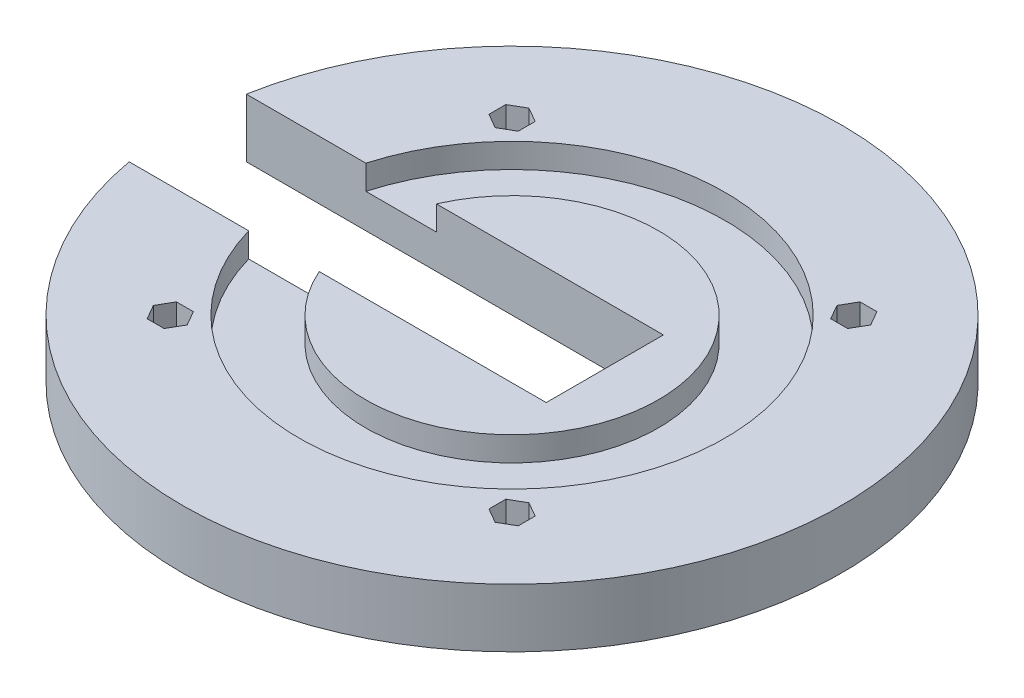
ISO-10303-21;
HEADER;
FILE_DESCRIPTION(('STEP AP214'),'2;1');
FILE_NAME('part.step','',(''),(''),'','','');
FILE_SCHEMA(('AUTOMOTIVE_DESIGN { 1 0 10303 214 1 1 1 1 }'));
ENDSEC;
DATA;
#1=APPLICATION_CONTEXT('core data for automotive mechanical design processes');
#2=APPLICATION_PROTOCOL_DEFINITION('international standard','automotive_design',2000,#1);
#3=PRODUCT_CONTEXT('',#1,'mechanical');
#4=PRODUCT('Part','Part','',(#3));
#5=PRODUCT_RELATED_PRODUCT_CATEGORY('part','',(#4));
#6=PRODUCT_DEFINITION_FORMATION('','',#4);
#7=PRODUCT_DEFINITION_CONTEXT('part definition',#1,'design');
#8=PRODUCT_DEFINITION('design','',#6,#7);
#9=PRODUCT_DEFINITION_SHAPE('','',#8);
#10=(LENGTH_UNIT() NAMED_UNIT(*) SI_UNIT(.MILLI.,.METRE.));
#11=(NAMED_UNIT(*) PLANE_ANGLE_UNIT() SI_UNIT($,.RADIAN.));
#12=(NAMED_UNIT(*) SI_UNIT($,.STERADIAN.) SOLID_ANGLE_UNIT());
#13=UNCERTAINTY_MEASURE_WITH_UNIT(LENGTH_MEASURE(1.E-05),#10,'distance_accuracy_value','');
#14=(GEOMETRIC_REPRESENTATION_CONTEXT(3) GLOBAL_UNCERTAINTY_ASSIGNED_CONTEXT((#13)) GLOBAL_UNIT_ASSIGNED_CONTEXT((#10,
#11,#12)) REPRESENTATION_CONTEXT('',''));
#15=CARTESIAN_POINT('',(0.,0.,0.));
#16=DIRECTION('',(0.,0.,1.));
#17=DIRECTION('',(1.,0.,0.));
#18=AXIS2_PLACEMENT_3D('',#15,#16,#17);
#19=CARTESIAN_POINT('',(0.,12.,0.));
#20=DIRECTION('',(0.,1.,0.));
#21=DIRECTION('',(0.,0.,1.));
#22=AXIS2_PLACEMENT_3D('',#19,#20,#21);
#23=PLANE('',#22);
#24=DIRECTION('',(1.,0.,0.));
#25=VECTOR('',#24,1.);
#26=CARTESIAN_POINT('',(-41.,12.,12.));
#27=LINE('',#26,#25);
#28=CARTESIAN_POINT('',(-27.495454169735,12.,12.));
#29=VERTEX_POINT('',#28);
#30=CARTESIAN_POINT('',(19.,12.,12.));
#31=VERTEX_POINT('',#30);
#32=EDGE_CURVE('E470',#29,#31,#27,.T.);
#33=ORIENTED_EDGE('',*,*,#32,.F.);
#34=CARTESIAN_POINT('',(0.,12.,0.));
#35=DIRECTION('',(0.,1.,0.));
#36=DIRECTION('',(0.,0.,1.));
#37=AXIS2_PLACEMENT_3D('',#34,#35,#36);
#38=CIRCLE('',#37,30.);
#39=CARTESIAN_POINT('',(-27.495454169735,12.,-12.));
#40=VERTEX_POINT('',#39);
#41=EDGE_CURVE('E266',#29,#40,#38,.T.);
#42=ORIENTED_EDGE('',*,*,#41,.T.);
#43=DIRECTION('',(-1.,0.,0.));
#44=VECTOR('',#43,1.);
#45=CARTESIAN_POINT('',(-41.,12.,-12.));
#46=LINE('',#45,#44);
#47=CARTESIAN_POINT('',(19.,12.,-12.));
#48=VERTEX_POINT('',#47);
#49=EDGE_CURVE('E477',#48,#40,#46,.T.);
#50=ORIENTED_EDGE('',*,*,#49,.F.);
#51=DIRECTION('',(0.,0.,-1.));
#52=VECTOR('',#51,1.);
#53=CARTESIAN_POINT('',(19.,12.,12.));
#54=LINE('',#53,#52);
#55=EDGE_CURVE('E455',#31,#48,#54,.T.);
#56=ORIENTED_EDGE('',*,*,#55,.F.);
#57=EDGE_LOOP('',(#33,#42,#50,#56));
#58=FACE_BOUND('',#57,.T.);
#59=ADVANCED_FACE('F35',(#58),#23,.T.);
#60=CARTESIAN_POINT('',(-41.,0.,12.));
#61=DIRECTION('',(0.,0.,1.));
#62=DIRECTION('',(1.,0.,0.));
#63=AXIS2_PLACEMENT_3D('',#60,#61,#62);
#64=PLANE('',#63);
#65=DIRECTION('',(-1.,0.,0.));
#66=VECTOR('',#65,1.);
#67=CARTESIAN_POINT('',(-41.,7.,12.));
#68=LINE('',#67,#66);
#69=CARTESIAN_POINT('',(-27.495454169735,7.,12.));
#70=VERTEX_POINT('',#69);
#71=CARTESIAN_POINT('',(-41.9421104023152,7.,12.));
#72=VERTEX_POINT('',#71);
#73=EDGE_CURVE('E271',#70,#72,#68,.T.);
#74=ORIENTED_EDGE('',*,*,#73,.F.);
#75=DIRECTION('',(0.,1.,0.));
#76=VECTOR('',#75,1.);
#77=CARTESIAN_POINT('',(-27.495454169735,7.,12.));
#78=LINE('',#77,#76);
#79=EDGE_CURVE('E264',#29,#70,#78,.F.);
#80=ORIENTED_EDGE('',*,*,#79,.F.);
#81=ORIENTED_EDGE('',*,*,#32,.T.);
#82=DIRECTION('',(0.,1.,0.));
#83=VECTOR('',#82,1.);
#84=CARTESIAN_POINT('',(19.,0.,12.));
#85=LINE('',#84,#83);
#86=CARTESIAN_POINT('',(19.,0.,12.));
#87=VERTEX_POINT('',#86);
#88=EDGE_CURVE('E481',#87,#31,#85,.T.);
#89=ORIENTED_EDGE('',*,*,#88,.F.);
#90=DIRECTION('',(1.,0.,0.));
#91=VECTOR('',#90,1.);
#92=CARTESIAN_POINT('',(-41.,0.,12.));
#93=LINE('',#92,#91);
#94=CARTESIAN_POINT('',(-66.4247694764536,0.,12.));
#95=VERTEX_POINT('',#94);
#96=EDGE_CURVE('E472',#95,#87,#93,.T.);
#97=ORIENTED_EDGE('',*,*,#96,.F.);
#98=DIRECTION('',(0.,-1.,0.));
#99=VECTOR('',#98,1.);
#100=CARTESIAN_POINT('',(-66.4247694764536,12.,12.));
#101=LINE('',#100,#99);
#102=CARTESIAN_POINT('',(-66.4247694764536,12.,12.));
#103=VERTEX_POINT('',#102);
#104=EDGE_CURVE('E504',#103,#95,#101,.T.);
#105=ORIENTED_EDGE('',*,*,#104,.F.);
#106=DIRECTION('',(1.,0.,0.));
#107=VECTOR('',#106,1.);
#108=CARTESIAN_POINT('',(-41.,12.,12.));
#109=LINE('',#108,#107);
#110=CARTESIAN_POINT('',(-41.9421104023152,12.,12.));
#111=VERTEX_POINT('',#110);
#112=EDGE_CURVE('E50',#103,#111,#109,.T.);
#113=ORIENTED_EDGE('',*,*,#112,.T.);
#114=DIRECTION('',(0.,1.,0.));
#115=VECTOR('',#114,1.);
#116=CARTESIAN_POINT('',(-41.9421104023152,7.,12.));
#117=LINE('',#116,#115);
#118=EDGE_CURVE('E11',#72,#111,#117,.T.);
#119=ORIENTED_EDGE('',*,*,#118,.F.);
#120=EDGE_LOOP('',(#74,#80,#81,#89,#97,#105,#113,#119));
#121=FACE_BOUND('',#120,.T.);
#122=ADVANCED_FACE('F518',(#121),#64,.F.);
#123=CARTESIAN_POINT('',(-41.,0.,-12.));
#124=DIRECTION('',(0.,0.,-1.));
#125=DIRECTION('',(-1.,0.,0.));
#126=AXIS2_PLACEMENT_3D('',#123,#124,#125);
#127=PLANE('',#126);
#128=DIRECTION('',(1.,0.,0.));
#129=VECTOR('',#128,1.);
#130=CARTESIAN_POINT('',(-41.,7.,-12.));
#131=LINE('',#130,#129);
#132=CARTESIAN_POINT('',(-41.9421104023152,7.,-12.));
#133=VERTEX_POINT('',#132);
#134=CARTESIAN_POINT('',(-27.495454169735,7.,-12.));
#135=VERTEX_POINT('',#134);
#136=EDGE_CURVE('E57',#133,#135,#131,.T.);
#137=ORIENTED_EDGE('',*,*,#136,.F.);
#138=DIRECTION('',(0.,1.,0.));
#139=VECTOR('',#138,1.);
#140=CARTESIAN_POINT('',(-41.9421104023152,7.,-12.));
#141=LINE('',#140,#139);
#142=CARTESIAN_POINT('',(-41.9421104023152,12.,-12.));
#143=VERTEX_POINT('',#142);
#144=EDGE_CURVE('E43',#143,#133,#141,.F.);
#145=ORIENTED_EDGE('',*,*,#144,.F.);
#146=DIRECTION('',(-1.,0.,0.));
#147=VECTOR('',#146,1.);
#148=CARTESIAN_POINT('',(-41.,12.,-12.));
#149=LINE('',#148,#147);
#150=CARTESIAN_POINT('',(-66.4247694764536,12.,-12.));
#151=VERTEX_POINT('',#150);
#152=EDGE_CURVE('E245',#143,#151,#149,.T.);
#153=ORIENTED_EDGE('',*,*,#152,.T.);
#154=DIRECTION('',(0.,-1.,0.));
#155=VECTOR('',#154,1.);
#156=CARTESIAN_POINT('',(-66.4247694764536,12.,-12.));
#157=LINE('',#156,#155);
#158=CARTESIAN_POINT('',(-66.4247694764536,0.,-12.));
#159=VERTEX_POINT('',#158);
#160=EDGE_CURVE('E506',#159,#151,#157,.F.);
#161=ORIENTED_EDGE('',*,*,#160,.F.);
#162=DIRECTION('',(-1.,0.,0.));
#163=VECTOR('',#162,1.);
#164=CARTESIAN_POINT('',(-41.,0.,-12.));
#165=LINE('',#164,#163);
#166=CARTESIAN_POINT('',(19.,0.,-12.));
#167=VERTEX_POINT('',#166);
#168=EDGE_CURVE('E469',#167,#159,#165,.T.);
#169=ORIENTED_EDGE('',*,*,#168,.F.);
#170=DIRECTION('',(0.,1.,0.));
#171=VECTOR('',#170,1.);
#172=CARTESIAN_POINT('',(19.,0.,-12.));
#173=LINE('',#172,#171);
#174=EDGE_CURVE('E475',#167,#48,#173,.T.);
#175=ORIENTED_EDGE('',*,*,#174,.T.);
#176=ORIENTED_EDGE('',*,*,#49,.T.);
#177=DIRECTION('',(0.,1.,0.));
#178=VECTOR('',#177,1.);
#179=CARTESIAN_POINT('',(-27.495454169735,7.,-12.));
#180=LINE('',#179,#178);
#181=EDGE_CURVE('E488',#135,#40,#180,.T.);
#182=ORIENTED_EDGE('',*,*,#181,.F.);
#183=EDGE_LOOP('',(#137,#145,#153,#161,#169,#175,#176,#182));
#184=FACE_BOUND('',#183,.T.);
#185=ADVANCED_FACE('F243',(#184),#127,.F.);
#186=CARTESIAN_POINT('',(0.,12.,0.));
#187=DIRECTION('',(0.,-1.,0.));
#188=DIRECTION('',(0.,0.,-1.));
#189=AXIS2_PLACEMENT_3D('',#186,#187,#188);
#190=CYLINDRICAL_SURFACE('',#189,67.5);
#191=CARTESIAN_POINT('',(0.,12.,0.));
#192=DIRECTION('',(0.,1.,0.));
#193=DIRECTION('',(0.,0.,1.));
#194=AXIS2_PLACEMENT_3D('',#191,#192,#193);
#195=CIRCLE('',#194,67.5);
#196=EDGE_CURVE('E258',#103,#151,#195,.T.);
#197=ORIENTED_EDGE('',*,*,#196,.F.);
#198=ORIENTED_EDGE('',*,*,#104,.T.);
#199=CARTESIAN_POINT('',(0.,0.,0.));
#200=DIRECTION('',(0.,1.,0.));
#201=DIRECTION('',(0.,0.,1.));
#202=AXIS2_PLACEMENT_3D('',#199,#200,#201);
#203=CIRCLE('',#202,67.5);
#204=EDGE_CURVE('E484',#95,#159,#203,.T.);
#205=ORIENTED_EDGE('',*,*,#204,.T.);
#206=ORIENTED_EDGE('',*,*,#160,.T.);
#207=EDGE_LOOP('',(#197,#198,#205,#206));
#208=FACE_BOUND('',#207,.T.);
#209=ADVANCED_FACE('F37',(#208),#190,.T.);
#210=ORIENTED_EDGE('',*,*,#112,.F.);
#211=ORIENTED_EDGE('',*,*,#196,.T.);
#212=ORIENTED_EDGE('',*,*,#152,.F.);
#213=CARTESIAN_POINT('',(0.,12.,0.));
#214=DIRECTION('',(0.,1.,0.));
#215=DIRECTION('',(0.,0.,1.));
#216=AXIS2_PLACEMENT_3D('',#213,#214,#215);
#217=CIRCLE('',#216,43.625);
#218=EDGE_CURVE('E256',#111,#143,#217,.T.);
#219=ORIENTED_EDGE('',*,*,#218,.F.);
#220=EDGE_LOOP('',(#210,#211,#212,#219));
#221=FACE_BOUND('',#220,.T.);
#222=DIRECTION('',(-0.866025403784439,0.,-0.5));
#223=VECTOR('',#222,1.);
#224=CARTESIAN_POINT('',(-32.0017856687342,12.,-36.733836476302));
#225=LINE('',#224,#223);
#226=CARTESIAN_POINT('',(-32.0017856687342,12.,-36.733836476302));
#227=VERTEX_POINT('',#226);
#228=CARTESIAN_POINT('',(-35.0017856687342,12.,-38.4658872838709));
#229=VERTEX_POINT('',#228);
#230=EDGE_CURVE('E273',#227,#229,#225,.T.);
#231=ORIENTED_EDGE('',*,*,#230,.F.);
#232=DIRECTION('',(0.,0.,-1.));
#233=VECTOR('',#232,1.);
#234=CARTESIAN_POINT('',(-32.0017856687342,12.,-33.2697348611643));
#235=LINE('',#234,#233);
#236=CARTESIAN_POINT('',(-32.0017856687342,12.,-33.2697348611643));
#237=VERTEX_POINT('',#236);
#238=EDGE_CURVE('E376',#237,#227,#235,.T.);
#239=ORIENTED_EDGE('',*,*,#238,.F.);
#240=DIRECTION('',(0.866025403784439,0.,-0.499999999999999));
#241=VECTOR('',#240,1.);
#242=CARTESIAN_POINT('',(-35.0017856687342,12.,-31.5376840535954));
#243=LINE('',#242,#241);
#244=CARTESIAN_POINT('',(-35.0017856687342,12.,-31.5376840535954));
#245=VERTEX_POINT('',#244);
#246=EDGE_CURVE('E402',#245,#237,#243,.T.);
#247=ORIENTED_EDGE('',*,*,#246,.F.);
#248=DIRECTION('',(0.866025403784438,0.,0.500000000000001));
#249=VECTOR('',#248,1.);
#250=CARTESIAN_POINT('',(-38.0017856687342,12.,-33.2697348611643));
#251=LINE('',#250,#249);
#252=CARTESIAN_POINT('',(-38.0017856687342,12.,-33.2697348611643));
#253=VERTEX_POINT('',#252);
#254=EDGE_CURVE('E399',#253,#245,#251,.T.);
#255=ORIENTED_EDGE('',*,*,#254,.F.);
#256=DIRECTION('',(0.,0.,1.));
#257=VECTOR('',#256,1.);
#258=CARTESIAN_POINT('',(-38.0017856687342,12.,-36.733836476302));
#259=LINE('',#258,#257);
#260=CARTESIAN_POINT('',(-38.0017856687342,12.,-36.733836476302));
#261=VERTEX_POINT('',#260);
#262=EDGE_CURVE('E396',#261,#253,#259,.T.);
#263=ORIENTED_EDGE('',*,*,#262,.F.);
#264=DIRECTION('',(-0.866025403784439,0.,0.5));
#265=VECTOR('',#264,1.);
#266=CARTESIAN_POINT('',(-35.0017856687342,12.,-38.4658872838709));
#267=LINE('',#266,#265);
#268=EDGE_CURVE('E393',#229,#261,#267,.T.);
#269=ORIENTED_EDGE('',*,*,#268,.F.);
#270=EDGE_LOOP('',(#231,#239,#247,#255,#263,#269));
#271=FACE_BOUND('',#270,.T.);
#272=DIRECTION('',(-0.5,0.,0.866025403784439));
#273=VECTOR('',#272,1.);
#274=CARTESIAN_POINT('',(-36.733836476302,12.,32.0017856687351));
#275=LINE('',#274,#273);
#276=CARTESIAN_POINT('',(-36.733836476302,12.,32.0017856687351));
#277=VERTEX_POINT('',#276);
#278=CARTESIAN_POINT('',(-38.4658872838709,12.,35.0017856687351));
#279=VERTEX_POINT('',#278);
#280=EDGE_CURVE('E344',#277,#279,#275,.T.);
#281=ORIENTED_EDGE('',*,*,#280,.F.);
#282=DIRECTION('',(-1.,0.,0.));
#283=VECTOR('',#282,1.);
#284=CARTESIAN_POINT('',(-33.2697348611643,12.,32.0017856687351));
#285=LINE('',#284,#283);
#286=CARTESIAN_POINT('',(-33.2697348611643,12.,32.0017856687351));
#287=VERTEX_POINT('',#286);
#288=EDGE_CURVE('E328',#287,#277,#285,.T.);
#289=ORIENTED_EDGE('',*,*,#288,.F.);
#290=DIRECTION('',(-0.499999999999999,0.,-0.866025403784439));
#291=VECTOR('',#290,1.);
#292=CARTESIAN_POINT('',(-31.5376840535954,12.,35.0017856687351));
#293=LINE('',#292,#291);
#294=CARTESIAN_POINT('',(-31.5376840535954,12.,35.0017856687351));
#295=VERTEX_POINT('',#294);
#296=EDGE_CURVE('E356',#295,#287,#293,.T.);
#297=ORIENTED_EDGE('',*,*,#296,.F.);
#298=DIRECTION('',(0.500000000000001,0.,-0.866025403784438));
#299=VECTOR('',#298,1.);
#300=CARTESIAN_POINT('',(-33.2697348611643,12.,38.0017856687351));
#301=LINE('',#300,#299);
#302=CARTESIAN_POINT('',(-33.2697348611643,12.,38.0017856687351));
#303=VERTEX_POINT('',#302);
#304=EDGE_CURVE('E353',#303,#295,#301,.T.);
#305=ORIENTED_EDGE('',*,*,#304,.F.);
#306=DIRECTION('',(1.,0.,0.));
#307=VECTOR('',#306,1.);
#308=CARTESIAN_POINT('',(-36.733836476302,12.,38.0017856687351));
#309=LINE('',#308,#307);
#310=CARTESIAN_POINT('',(-36.733836476302,12.,38.0017856687351));
#311=VERTEX_POINT('',#310);
#312=EDGE_CURVE('E350',#311,#303,#309,.T.);
#313=ORIENTED_EDGE('',*,*,#312,.F.);
#314=DIRECTION('',(0.5,0.,0.866025403784439));
#315=VECTOR('',#314,1.);
#316=CARTESIAN_POINT('',(-38.4658872838709,12.,35.0017856687351));
#317=LINE('',#316,#315);
#318=EDGE_CURVE('E346',#279,#311,#317,.T.);
#319=ORIENTED_EDGE('',*,*,#318,.F.);
#320=EDGE_LOOP('',(#281,#289,#297,#305,#313,#319));
#321=FACE_BOUND('',#320,.T.);
#322=DIRECTION('',(0.866025403784439,0.,0.5));
#323=VECTOR('',#322,1.);
#324=CARTESIAN_POINT('',(32.0017856687351,12.,36.733836476303));
#325=LINE('',#324,#323);
#326=CARTESIAN_POINT('',(32.0017856687351,12.,36.733836476303));
#327=VERTEX_POINT('',#326);
#328=CARTESIAN_POINT('',(35.0017856687351,12.,38.4658872838718));
#329=VERTEX_POINT('',#328);
#330=EDGE_CURVE('E294',#327,#329,#325,.T.);
#331=ORIENTED_EDGE('',*,*,#330,.F.);
#332=DIRECTION('',(0.,0.,1.));
#333=VECTOR('',#332,1.);
#334=CARTESIAN_POINT('',(32.0017856687351,12.,33.2697348611652));
#335=LINE('',#334,#333);
#336=CARTESIAN_POINT('',(32.0017856687351,12.,33.2697348611652));
#337=VERTEX_POINT('',#336);
#338=EDGE_CURVE('E278',#337,#327,#335,.T.);
#339=ORIENTED_EDGE('',*,*,#338,.F.);
#340=DIRECTION('',(-0.866025403784439,0.,0.499999999999999));
#341=VECTOR('',#340,1.);
#342=CARTESIAN_POINT('',(35.0017856687351,12.,31.5376840535963));
#343=LINE('',#342,#341);
#344=CARTESIAN_POINT('',(35.0017856687351,12.,31.5376840535963));
#345=VERTEX_POINT('',#344);
#346=EDGE_CURVE('E306',#345,#337,#343,.T.);
#347=ORIENTED_EDGE('',*,*,#346,.F.);
#348=DIRECTION('',(-0.866025403784438,0.,-0.500000000000001));
#349=VECTOR('',#348,1.);
#350=CARTESIAN_POINT('',(38.0017856687351,12.,33.2697348611652));
#351=LINE('',#350,#349);
#352=CARTESIAN_POINT('',(38.0017856687351,12.,33.2697348611652));
#353=VERTEX_POINT('',#352);
#354=EDGE_CURVE('E303',#353,#345,#351,.T.);
#355=ORIENTED_EDGE('',*,*,#354,.F.);
#356=DIRECTION('',(0.,0.,-1.));
#357=VECTOR('',#356,1.);
#358=CARTESIAN_POINT('',(38.0017856687351,12.,36.7338364763029));
#359=LINE('',#358,#357);
#360=CARTESIAN_POINT('',(38.0017856687351,12.,36.7338364763029));
#361=VERTEX_POINT('',#360);
#362=EDGE_CURVE('E300',#361,#353,#359,.T.);
#363=ORIENTED_EDGE('',*,*,#362,.F.);
#364=DIRECTION('',(0.866025403784439,0.,-0.5));
#365=VECTOR('',#364,1.);
#366=CARTESIAN_POINT('',(35.0017856687351,12.,38.4658872838718));
#367=LINE('',#366,#365);
#368=EDGE_CURVE('E296',#329,#361,#367,.T.);
#369=ORIENTED_EDGE('',*,*,#368,.F.);
#370=EDGE_LOOP('',(#331,#339,#347,#355,#363,#369));
#371=FACE_BOUND('',#370,.T.);
#372=DIRECTION('',(0.499999999999999,0.,-0.866025403784439));
#373=VECTOR('',#372,1.);
#374=CARTESIAN_POINT('',(36.7338364763029,12.,-32.0017856687342));
#375=LINE('',#374,#373);
#376=CARTESIAN_POINT('',(36.7338364763029,12.,-32.0017856687342));
#377=VERTEX_POINT('',#376);
#378=CARTESIAN_POINT('',(38.4658872838718,12.,-35.0017856687342));
#379=VERTEX_POINT('',#378);
#380=EDGE_CURVE('E313',#377,#379,#375,.T.);
#381=ORIENTED_EDGE('',*,*,#380,.F.);
#382=DIRECTION('',(1.,0.,0.));
#383=VECTOR('',#382,1.);
#384=CARTESIAN_POINT('',(33.2697348611652,12.,-32.0017856687342));
#385=LINE('',#384,#383);
#386=CARTESIAN_POINT('',(33.2697348611652,12.,-32.0017856687342));
#387=VERTEX_POINT('',#386);
#388=EDGE_CURVE('E422',#387,#377,#385,.T.);
#389=ORIENTED_EDGE('',*,*,#388,.F.);
#390=DIRECTION('',(0.499999999999999,0.,0.866025403784439));
#391=VECTOR('',#390,1.);
#392=CARTESIAN_POINT('',(31.5376840535963,12.,-35.0017856687342));
#393=LINE('',#392,#391);
#394=CARTESIAN_POINT('',(31.5376840535963,12.,-35.0017856687342));
#395=VERTEX_POINT('',#394);
#396=EDGE_CURVE('E448',#395,#387,#393,.T.);
#397=ORIENTED_EDGE('',*,*,#396,.F.);
#398=DIRECTION('',(-0.5,0.,0.866025403784439));
#399=VECTOR('',#398,1.);
#400=CARTESIAN_POINT('',(33.2697348611652,12.,-38.0017856687342));
#401=LINE('',#400,#399);
#402=CARTESIAN_POINT('',(33.2697348611652,12.,-38.0017856687342));
#403=VERTEX_POINT('',#402);
#404=EDGE_CURVE('E445',#403,#395,#401,.T.);
#405=ORIENTED_EDGE('',*,*,#404,.F.);
#406=DIRECTION('',(-1.,0.,0.));
#407=VECTOR('',#406,1.);
#408=CARTESIAN_POINT('',(36.7338364763029,12.,-38.0017856687342));
#409=LINE('',#408,#407);
#410=CARTESIAN_POINT('',(36.7338364763029,12.,-38.0017856687342));
#411=VERTEX_POINT('',#410);
#412=EDGE_CURVE('E442',#411,#403,#409,.T.);
#413=ORIENTED_EDGE('',*,*,#412,.F.);
#414=DIRECTION('',(-0.5,0.,-0.866025403784438));
#415=VECTOR('',#414,1.);
#416=CARTESIAN_POINT('',(38.4658872838718,12.,-35.0017856687342));
#417=LINE('',#416,#415);
#418=EDGE_CURVE('E439',#379,#411,#417,.T.);
#419=ORIENTED_EDGE('',*,*,#418,.F.);
#420=EDGE_LOOP('',(#381,#389,#397,#405,#413,#419));
#421=FACE_BOUND('',#420,.T.);
#422=ADVANCED_FACE('F254',(#221,#271,#321,#371,#421),#23,.T.);
#423=CARTESIAN_POINT('',(0.,0.,0.));
#424=DIRECTION('',(0.,1.,0.));
#425=DIRECTION('',(0.,0.,1.));
#426=AXIS2_PLACEMENT_3D('',#423,#424,#425);
#427=PLANE('',#426);
#428=DIRECTION('',(0.,0.,-1.));
#429=VECTOR('',#428,1.);
#430=CARTESIAN_POINT('',(-32.0017856687342,0.,-33.2697348611643));
#431=LINE('',#430,#429);
#432=CARTESIAN_POINT('',(-32.0017856687342,0.,-33.2697348611643));
#433=VERTEX_POINT('',#432);
#434=CARTESIAN_POINT('',(-32.0017856687342,0.,-36.733836476302));
#435=VERTEX_POINT('',#434);
#436=EDGE_CURVE('E388',#433,#435,#431,.T.);
#437=ORIENTED_EDGE('',*,*,#436,.T.);
#438=DIRECTION('',(-0.866025403784439,0.,-0.5));
#439=VECTOR('',#438,1.);
#440=CARTESIAN_POINT('',(-32.0017856687342,0.,-36.733836476302));
#441=LINE('',#440,#439);
#442=CARTESIAN_POINT('',(-35.0017856687342,0.,-38.4658872838709));
#443=VERTEX_POINT('',#442);
#444=EDGE_CURVE('E372',#435,#443,#441,.T.);
#445=ORIENTED_EDGE('',*,*,#444,.T.);
#446=DIRECTION('',(-0.866025403784439,0.,0.5));
#447=VECTOR('',#446,1.);
#448=CARTESIAN_POINT('',(-35.0017856687342,0.,-38.4658872838709));
#449=LINE('',#448,#447);
#450=CARTESIAN_POINT('',(-38.0017856687342,0.,-36.733836476302));
#451=VERTEX_POINT('',#450);
#452=EDGE_CURVE('E375',#443,#451,#449,.T.);
#453=ORIENTED_EDGE('',*,*,#452,.T.);
#454=DIRECTION('',(0.,0.,1.));
#455=VECTOR('',#454,1.);
#456=CARTESIAN_POINT('',(-38.0017856687342,0.,-36.733836476302));
#457=LINE('',#456,#455);
#458=CARTESIAN_POINT('',(-38.0017856687342,0.,-33.2697348611643));
#459=VERTEX_POINT('',#458);
#460=EDGE_CURVE('E379',#451,#459,#457,.T.);
#461=ORIENTED_EDGE('',*,*,#460,.T.);
#462=DIRECTION('',(0.866025403784438,0.,0.500000000000001));
#463=VECTOR('',#462,1.);
#464=CARTESIAN_POINT('',(-38.0017856687342,0.,-33.2697348611643));
#465=LINE('',#464,#463);
#466=CARTESIAN_POINT('',(-35.0017856687342,0.,-31.5376840535954));
#467=VERTEX_POINT('',#466);
#468=EDGE_CURVE('E382',#459,#467,#465,.T.);
#469=ORIENTED_EDGE('',*,*,#468,.T.);
#470=DIRECTION('',(0.866025403784439,0.,-0.499999999999999));
#471=VECTOR('',#470,1.);
#472=CARTESIAN_POINT('',(-35.0017856687342,0.,-31.5376840535954));
#473=LINE('',#472,#471);
#474=EDGE_CURVE('E385',#467,#433,#473,.T.);
#475=ORIENTED_EDGE('',*,*,#474,.T.);
#476=EDGE_LOOP('',(#437,#445,#453,#461,#469,#475));
#477=FACE_BOUND('',#476,.T.);
#478=DIRECTION('',(-1.,0.,0.));
#479=VECTOR('',#478,1.);
#480=CARTESIAN_POINT('',(-33.2697348611643,0.,32.0017856687351));
#481=LINE('',#480,#479);
#482=CARTESIAN_POINT('',(-33.2697348611643,0.,32.0017856687351));
#483=VERTEX_POINT('',#482);
#484=CARTESIAN_POINT('',(-36.733836476302,0.,32.0017856687351));
#485=VERTEX_POINT('',#484);
#486=EDGE_CURVE('E340',#483,#485,#481,.T.);
#487=ORIENTED_EDGE('',*,*,#486,.T.);
#488=DIRECTION('',(-0.5,0.,0.866025403784439));
#489=VECTOR('',#488,1.);
#490=CARTESIAN_POINT('',(-36.733836476302,0.,32.0017856687351));
#491=LINE('',#490,#489);
#492=CARTESIAN_POINT('',(-38.4658872838709,0.,35.0017856687351));
#493=VERTEX_POINT('',#492);
#494=EDGE_CURVE('E324',#485,#493,#491,.T.);
#495=ORIENTED_EDGE('',*,*,#494,.T.);
#496=DIRECTION('',(0.5,0.,0.866025403784439));
#497=VECTOR('',#496,1.);
#498=CARTESIAN_POINT('',(-38.4658872838709,0.,35.0017856687351));
#499=LINE('',#498,#497);
#500=CARTESIAN_POINT('',(-36.733836476302,0.,38.0017856687351));
#501=VERTEX_POINT('',#500);
#502=EDGE_CURVE('E327',#493,#501,#499,.T.);
#503=ORIENTED_EDGE('',*,*,#502,.T.);
#504=DIRECTION('',(1.,0.,0.));
#505=VECTOR('',#504,1.);
#506=CARTESIAN_POINT('',(-36.733836476302,0.,38.0017856687351));
#507=LINE('',#506,#505);
#508=CARTESIAN_POINT('',(-33.2697348611643,0.,38.0017856687351));
#509=VERTEX_POINT('',#508);
#510=EDGE_CURVE('E331',#501,#509,#507,.T.);
#511=ORIENTED_EDGE('',*,*,#510,.T.);
#512=DIRECTION('',(0.500000000000001,0.,-0.866025403784438));
#513=VECTOR('',#512,1.);
#514=CARTESIAN_POINT('',(-33.2697348611643,0.,38.0017856687351));
#515=LINE('',#514,#513);
#516=CARTESIAN_POINT('',(-31.5376840535954,0.,35.0017856687351));
#517=VERTEX_POINT('',#516);
#518=EDGE_CURVE('E334',#509,#517,#515,.T.);
#519=ORIENTED_EDGE('',*,*,#518,.T.);
#520=DIRECTION('',(-0.499999999999999,0.,-0.866025403784439));
#521=VECTOR('',#520,1.);
#522=CARTESIAN_POINT('',(-31.5376840535954,0.,35.0017856687351));
#523=LINE('',#522,#521);
#524=EDGE_CURVE('E337',#517,#483,#523,.T.);
#525=ORIENTED_EDGE('',*,*,#524,.T.);
#526=EDGE_LOOP('',(#487,#495,#503,#511,#519,#525));
#527=FACE_BOUND('',#526,.T.);
#528=DIRECTION('',(0.,0.,1.));
#529=VECTOR('',#528,1.);
#530=CARTESIAN_POINT('',(32.0017856687351,0.,33.2697348611652));
#531=LINE('',#530,#529);
#532=CARTESIAN_POINT('',(32.0017856687351,0.,33.2697348611652));
#533=VERTEX_POINT('',#532);
#534=CARTESIAN_POINT('',(32.0017856687351,0.,36.733836476303));
#535=VERTEX_POINT('',#534);
#536=EDGE_CURVE('E290',#533,#535,#531,.T.);
#537=ORIENTED_EDGE('',*,*,#536,.T.);
#538=DIRECTION('',(0.866025403784439,0.,0.5));
#539=VECTOR('',#538,1.);
#540=CARTESIAN_POINT('',(32.0017856687351,0.,36.733836476303));
#541=LINE('',#540,#539);
#542=CARTESIAN_POINT('',(35.0017856687351,0.,38.4658872838718));
#543=VERTEX_POINT('',#542);
#544=EDGE_CURVE('E274',#535,#543,#541,.T.);
#545=ORIENTED_EDGE('',*,*,#544,.T.);
#546=DIRECTION('',(0.866025403784439,0.,-0.5));
#547=VECTOR('',#546,1.);
#548=CARTESIAN_POINT('',(35.0017856687351,0.,38.4658872838718));
#549=LINE('',#548,#547);
#550=CARTESIAN_POINT('',(38.0017856687351,0.,36.7338364763029));
#551=VERTEX_POINT('',#550);
#552=EDGE_CURVE('E277',#543,#551,#549,.T.);
#553=ORIENTED_EDGE('',*,*,#552,.T.);
#554=DIRECTION('',(0.,0.,-1.));
#555=VECTOR('',#554,1.);
#556=CARTESIAN_POINT('',(38.0017856687351,0.,36.7338364763029));
#557=LINE('',#556,#555);
#558=CARTESIAN_POINT('',(38.0017856687351,0.,33.2697348611652));
#559=VERTEX_POINT('',#558);
#560=EDGE_CURVE('E281',#551,#559,#557,.T.);
#561=ORIENTED_EDGE('',*,*,#560,.T.);
#562=DIRECTION('',(-0.866025403784438,0.,-0.500000000000001));
#563=VECTOR('',#562,1.);
#564=CARTESIAN_POINT('',(38.0017856687351,0.,33.2697348611652));
#565=LINE('',#564,#563);
#566=CARTESIAN_POINT('',(35.0017856687351,0.,31.5376840535963));
#567=VERTEX_POINT('',#566);
#568=EDGE_CURVE('E284',#559,#567,#565,.T.);
#569=ORIENTED_EDGE('',*,*,#568,.T.);
#570=DIRECTION('',(-0.866025403784439,0.,0.499999999999999));
#571=VECTOR('',#570,1.);
#572=CARTESIAN_POINT('',(35.0017856687351,0.,31.5376840535963));
#573=LINE('',#572,#571);
#574=EDGE_CURVE('E287',#567,#533,#573,.T.);
#575=ORIENTED_EDGE('',*,*,#574,.T.);
#576=EDGE_LOOP('',(#537,#545,#553,#561,#569,#575));
#577=FACE_BOUND('',#576,.T.);
#578=DIRECTION('',(1.,0.,0.));
#579=VECTOR('',#578,1.);
#580=CARTESIAN_POINT('',(33.2697348611652,0.,-32.0017856687342));
#581=LINE('',#580,#579);
#582=CARTESIAN_POINT('',(33.2697348611652,0.,-32.0017856687342));
#583=VERTEX_POINT('',#582);
#584=CARTESIAN_POINT('',(36.7338364763029,0.,-32.0017856687342));
#585=VERTEX_POINT('',#584);
#586=EDGE_CURVE('E434',#583,#585,#581,.T.);
#587=ORIENTED_EDGE('',*,*,#586,.T.);
#588=DIRECTION('',(0.499999999999999,0.,-0.866025403784439));
#589=VECTOR('',#588,1.);
#590=CARTESIAN_POINT('',(36.7338364763029,0.,-32.0017856687342));
#591=LINE('',#590,#589);
#592=CARTESIAN_POINT('',(38.4658872838718,0.,-35.0017856687342));
#593=VERTEX_POINT('',#592);
#594=EDGE_CURVE('E418',#585,#593,#591,.T.);
#595=ORIENTED_EDGE('',*,*,#594,.T.);
#596=DIRECTION('',(-0.5,0.,-0.866025403784438));
#597=VECTOR('',#596,1.);
#598=CARTESIAN_POINT('',(38.4658872838718,0.,-35.0017856687342));
#599=LINE('',#598,#597);
#600=CARTESIAN_POINT('',(36.7338364763029,0.,-38.0017856687342));
#601=VERTEX_POINT('',#600);
#602=EDGE_CURVE('E421',#593,#601,#599,.T.);
#603=ORIENTED_EDGE('',*,*,#602,.T.);
#604=DIRECTION('',(-1.,0.,0.));
#605=VECTOR('',#604,1.);
#606=CARTESIAN_POINT('',(36.7338364763029,0.,-38.0017856687342));
#607=LINE('',#606,#605);
#608=CARTESIAN_POINT('',(33.2697348611652,0.,-38.0017856687342));
#609=VERTEX_POINT('',#608);
#610=EDGE_CURVE('E425',#601,#609,#607,.T.);
#611=ORIENTED_EDGE('',*,*,#610,.T.);
#612=DIRECTION('',(-0.5,0.,0.866025403784439));
#613=VECTOR('',#612,1.);
#614=CARTESIAN_POINT('',(33.2697348611652,0.,-38.0017856687342));
#615=LINE('',#614,#613);
#616=CARTESIAN_POINT('',(31.5376840535963,0.,-35.0017856687342));
#617=VERTEX_POINT('',#616);
#618=EDGE_CURVE('E428',#609,#617,#615,.T.);
#619=ORIENTED_EDGE('',*,*,#618,.T.);
#620=DIRECTION('',(0.499999999999999,0.,0.866025403784439));
#621=VECTOR('',#620,1.);
#622=CARTESIAN_POINT('',(31.5376840535963,0.,-35.0017856687342));
#623=LINE('',#622,#621);
#624=EDGE_CURVE('E431',#617,#583,#623,.T.);
#625=ORIENTED_EDGE('',*,*,#624,.T.);
#626=EDGE_LOOP('',(#587,#595,#603,#611,#619,#625));
#627=FACE_BOUND('',#626,.T.);
#628=ORIENTED_EDGE('',*,*,#204,.F.);
#629=ORIENTED_EDGE('',*,*,#96,.T.);
#630=DIRECTION('',(0.,0.,-1.));
#631=VECTOR('',#630,1.);
#632=CARTESIAN_POINT('',(19.,0.,12.));
#633=LINE('',#632,#631);
#634=EDGE_CURVE('E466',#87,#167,#633,.T.);
#635=ORIENTED_EDGE('',*,*,#634,.T.);
#636=ORIENTED_EDGE('',*,*,#168,.T.);
#637=EDGE_LOOP('',(#628,#629,#635,#636));
#638=FACE_BOUND('',#637,.T.);
#639=ADVANCED_FACE('F515',(#477,#527,#577,#627,#638),#427,.F.);
#640=CARTESIAN_POINT('',(19.,0.,12.));
#641=DIRECTION('',(1.,0.,0.));
#642=DIRECTION('',(0.,0.,-1.));
#643=AXIS2_PLACEMENT_3D('',#640,#641,#642);
#644=PLANE('',#643);
#645=ORIENTED_EDGE('',*,*,#55,.T.);
#646=ORIENTED_EDGE('',*,*,#174,.F.);
#647=ORIENTED_EDGE('',*,*,#634,.F.);
#648=ORIENTED_EDGE('',*,*,#88,.T.);
#649=EDGE_LOOP('',(#645,#646,#647,#648));
#650=FACE_BOUND('',#649,.T.);
#651=ADVANCED_FACE('F517',(#650),#644,.F.);
#652=CARTESIAN_POINT('',(36.7338364763029,0.,-32.0017856687342));
#653=DIRECTION('',(0.866025403784439,0.,0.499999999999999));
#654=DIRECTION('',(0.499999999999999,0.,-0.866025403784439));
#655=AXIS2_PLACEMENT_3D('',#652,#653,#654);
#656=PLANE('',#655);
#657=ORIENTED_EDGE('',*,*,#380,.T.);
#658=DIRECTION('',(0.,1.,0.));
#659=VECTOR('',#658,1.);
#660=CARTESIAN_POINT('',(38.4658872838718,0.,-35.0017856687342));
#661=LINE('',#660,#659);
#662=EDGE_CURVE('E437',#593,#379,#661,.T.);
#663=ORIENTED_EDGE('',*,*,#662,.F.);
#664=ORIENTED_EDGE('',*,*,#594,.F.);
#665=DIRECTION('',(0.,1.,0.));
#666=VECTOR('',#665,1.);
#667=CARTESIAN_POINT('',(36.7338364763029,0.,-32.0017856687342));
#668=LINE('',#667,#666);
#669=EDGE_CURVE('E453',#585,#377,#668,.T.);
#670=ORIENTED_EDGE('',*,*,#669,.T.);
#671=EDGE_LOOP('',(#657,#663,#664,#670));
#672=FACE_BOUND('',#671,.T.);
#673=ADVANCED_FACE('F529',(#672),#656,.F.);
#674=CARTESIAN_POINT('',(33.2697348611652,0.,-32.0017856687342));
#675=DIRECTION('',(0.,0.,1.));
#676=DIRECTION('',(1.,0.,0.));
#677=AXIS2_PLACEMENT_3D('',#674,#675,#676);
#678=PLANE('',#677);
#679=ORIENTED_EDGE('',*,*,#388,.T.);
#680=ORIENTED_EDGE('',*,*,#669,.F.);
#681=ORIENTED_EDGE('',*,*,#586,.F.);
#682=DIRECTION('',(0.,1.,0.));
#683=VECTOR('',#682,1.);
#684=CARTESIAN_POINT('',(33.2697348611652,0.,-32.0017856687342));
#685=LINE('',#684,#683);
#686=EDGE_CURVE('E456',#583,#387,#685,.T.);
#687=ORIENTED_EDGE('',*,*,#686,.T.);
#688=EDGE_LOOP('',(#679,#680,#681,#687));
#689=FACE_BOUND('',#688,.T.);
#690=ADVANCED_FACE('F549',(#689),#678,.F.);
#691=CARTESIAN_POINT('',(31.5376840535963,0.,-35.0017856687342));
#692=DIRECTION('',(-0.866025403784439,0.,0.499999999999999));
#693=DIRECTION('',(0.499999999999999,0.,0.866025403784439));
#694=AXIS2_PLACEMENT_3D('',#691,#692,#693);
#695=PLANE('',#694);
#696=ORIENTED_EDGE('',*,*,#396,.T.);
#697=ORIENTED_EDGE('',*,*,#686,.F.);
#698=ORIENTED_EDGE('',*,*,#624,.F.);
#699=DIRECTION('',(0.,1.,0.));
#700=VECTOR('',#699,1.);
#701=CARTESIAN_POINT('',(31.5376840535963,0.,-35.0017856687342));
#702=LINE('',#701,#700);
#703=EDGE_CURVE('E458',#617,#395,#702,.T.);
#704=ORIENTED_EDGE('',*,*,#703,.T.);
#705=EDGE_LOOP('',(#696,#697,#698,#704));
#706=FACE_BOUND('',#705,.T.);
#707=ADVANCED_FACE('F567',(#706),#695,.F.);
#708=CARTESIAN_POINT('',(33.2697348611652,0.,-38.0017856687342));
#709=DIRECTION('',(-0.866025403784439,0.,-0.5));
#710=DIRECTION('',(-0.5,0.,0.866025403784439));
#711=AXIS2_PLACEMENT_3D('',#708,#709,#710);
#712=PLANE('',#711);
#713=ORIENTED_EDGE('',*,*,#404,.T.);
#714=ORIENTED_EDGE('',*,*,#703,.F.);
#715=ORIENTED_EDGE('',*,*,#618,.F.);
#716=DIRECTION('',(0.,1.,0.));
#717=VECTOR('',#716,1.);
#718=CARTESIAN_POINT('',(33.2697348611652,0.,-38.0017856687342));
#719=LINE('',#718,#717);
#720=EDGE_CURVE('E460',#609,#403,#719,.T.);
#721=ORIENTED_EDGE('',*,*,#720,.T.);
#722=EDGE_LOOP('',(#713,#714,#715,#721));
#723=FACE_BOUND('',#722,.T.);
#724=ADVANCED_FACE('F564',(#723),#712,.F.);
#725=CARTESIAN_POINT('',(36.7338364763029,0.,-38.0017856687342));
#726=DIRECTION('',(0.,0.,-1.));
#727=DIRECTION('',(-1.,0.,0.));
#728=AXIS2_PLACEMENT_3D('',#725,#726,#727);
#729=PLANE('',#728);
#730=ORIENTED_EDGE('',*,*,#412,.T.);
#731=ORIENTED_EDGE('',*,*,#720,.F.);
#732=ORIENTED_EDGE('',*,*,#610,.F.);
#733=DIRECTION('',(0.,1.,0.));
#734=VECTOR('',#733,1.);
#735=CARTESIAN_POINT('',(36.7338364763029,0.,-38.0017856687342));
#736=LINE('',#735,#734);
#737=EDGE_CURVE('E462',#601,#411,#736,.T.);
#738=ORIENTED_EDGE('',*,*,#737,.T.);
#739=EDGE_LOOP('',(#730,#731,#732,#738));
#740=FACE_BOUND('',#739,.T.);
#741=ADVANCED_FACE('F560',(#740),#729,.F.);
#742=CARTESIAN_POINT('',(38.4658872838718,0.,-35.0017856687342));
#743=DIRECTION('',(0.866025403784439,0.,-0.5));
#744=DIRECTION('',(-0.5,0.,-0.866025403784439));
#745=AXIS2_PLACEMENT_3D('',#742,#743,#744);
#746=PLANE('',#745);
#747=ORIENTED_EDGE('',*,*,#418,.T.);
#748=ORIENTED_EDGE('',*,*,#737,.F.);
#749=ORIENTED_EDGE('',*,*,#602,.F.);
#750=ORIENTED_EDGE('',*,*,#662,.T.);
#751=EDGE_LOOP('',(#747,#748,#749,#750));
#752=FACE_BOUND('',#751,.T.);
#753=ADVANCED_FACE('F557',(#752),#746,.F.);
#754=CARTESIAN_POINT('',(32.0017856687351,0.,36.733836476303));
#755=DIRECTION('',(-0.5,0.,0.866025403784439));
#756=DIRECTION('',(0.866025403784439,0.,0.5));
#757=AXIS2_PLACEMENT_3D('',#754,#755,#756);
#758=PLANE('',#757);
#759=ORIENTED_EDGE('',*,*,#330,.T.);
#760=DIRECTION('',(0.,1.,0.));
#761=VECTOR('',#760,1.);
#762=CARTESIAN_POINT('',(35.0017856687351,0.,38.4658872838718));
#763=LINE('',#762,#761);
#764=EDGE_CURVE('E293',#543,#329,#763,.T.);
#765=ORIENTED_EDGE('',*,*,#764,.F.);
#766=ORIENTED_EDGE('',*,*,#544,.F.);
#767=DIRECTION('',(0.,1.,0.));
#768=VECTOR('',#767,1.);
#769=CARTESIAN_POINT('',(32.0017856687351,0.,36.733836476303));
#770=LINE('',#769,#768);
#771=EDGE_CURVE('E311',#535,#327,#770,.T.);
#772=ORIENTED_EDGE('',*,*,#771,.T.);
#773=EDGE_LOOP('',(#759,#765,#766,#772));
#774=FACE_BOUND('',#773,.T.);
#775=ADVANCED_FACE('F581',(#774),#758,.F.);
#776=CARTESIAN_POINT('',(32.0017856687351,0.,33.2697348611652));
#777=DIRECTION('',(-1.,0.,0.));
#778=DIRECTION('',(0.,0.,1.));
#779=AXIS2_PLACEMENT_3D('',#776,#777,#778);
#780=PLANE('',#779);
#781=ORIENTED_EDGE('',*,*,#338,.T.);
#782=ORIENTED_EDGE('',*,*,#771,.F.);
#783=ORIENTED_EDGE('',*,*,#536,.F.);
#784=DIRECTION('',(0.,1.,0.));
#785=VECTOR('',#784,1.);
#786=CARTESIAN_POINT('',(32.0017856687351,0.,33.2697348611652));
#787=LINE('',#786,#785);
#788=EDGE_CURVE('E314',#533,#337,#787,.T.);
#789=ORIENTED_EDGE('',*,*,#788,.T.);
#790=EDGE_LOOP('',(#781,#782,#783,#789));
#791=FACE_BOUND('',#790,.T.);
#792=ADVANCED_FACE('F585',(#791),#780,.F.);
#793=CARTESIAN_POINT('',(35.0017856687351,0.,31.5376840535963));
#794=DIRECTION('',(-0.499999999999999,0.,-0.866025403784439));
#795=DIRECTION('',(-0.866025403784439,0.,0.499999999999999));
#796=AXIS2_PLACEMENT_3D('',#793,#794,#795);
#797=PLANE('',#796);
#798=ORIENTED_EDGE('',*,*,#346,.T.);
#799=ORIENTED_EDGE('',*,*,#788,.F.);
#800=ORIENTED_EDGE('',*,*,#574,.F.);
#801=DIRECTION('',(0.,1.,0.));
#802=VECTOR('',#801,1.);
#803=CARTESIAN_POINT('',(35.0017856687351,0.,31.5376840535963));
#804=LINE('',#803,#802);
#805=EDGE_CURVE('E316',#567,#345,#804,.T.);
#806=ORIENTED_EDGE('',*,*,#805,.T.);
#807=EDGE_LOOP('',(#798,#799,#800,#806));
#808=FACE_BOUND('',#807,.T.);
#809=ADVANCED_FACE('F591',(#808),#797,.F.);
#810=CARTESIAN_POINT('',(38.0017856687351,0.,33.2697348611652));
#811=DIRECTION('',(0.500000000000001,0.,-0.866025403784438));
#812=DIRECTION('',(-0.866025403784438,0.,-0.500000000000001));
#813=AXIS2_PLACEMENT_3D('',#810,#811,#812);
#814=PLANE('',#813);
#815=ORIENTED_EDGE('',*,*,#354,.T.);
#816=ORIENTED_EDGE('',*,*,#805,.F.);
#817=ORIENTED_EDGE('',*,*,#568,.F.);
#818=DIRECTION('',(0.,1.,0.));
#819=VECTOR('',#818,1.);
#820=CARTESIAN_POINT('',(38.0017856687351,0.,33.2697348611652));
#821=LINE('',#820,#819);
#822=EDGE_CURVE('E318',#559,#353,#821,.T.);
#823=ORIENTED_EDGE('',*,*,#822,.T.);
#824=EDGE_LOOP('',(#815,#816,#817,#823));
#825=FACE_BOUND('',#824,.T.);
#826=ADVANCED_FACE('F676',(#825),#814,.F.);
#827=CARTESIAN_POINT('',(38.0017856687351,0.,36.7338364763029));
#828=DIRECTION('',(1.,0.,0.));
#829=DIRECTION('',(0.,0.,-1.));
#830=AXIS2_PLACEMENT_3D('',#827,#828,#829);
#831=PLANE('',#830);
#832=ORIENTED_EDGE('',*,*,#362,.T.);
#833=ORIENTED_EDGE('',*,*,#822,.F.);
#834=ORIENTED_EDGE('',*,*,#560,.F.);
#835=DIRECTION('',(0.,1.,0.));
#836=VECTOR('',#835,1.);
#837=CARTESIAN_POINT('',(38.0017856687351,0.,36.7338364763029));
#838=LINE('',#837,#836);
#839=EDGE_CURVE('E320',#551,#361,#838,.T.);
#840=ORIENTED_EDGE('',*,*,#839,.T.);
#841=EDGE_LOOP('',(#832,#833,#834,#840));
#842=FACE_BOUND('',#841,.T.);
#843=ADVANCED_FACE('F673',(#842),#831,.F.);
#844=CARTESIAN_POINT('',(35.0017856687351,0.,38.4658872838718));
#845=DIRECTION('',(0.5,0.,0.866025403784439));
#846=DIRECTION('',(0.866025403784439,0.,-0.5));
#847=AXIS2_PLACEMENT_3D('',#844,#845,#846);
#848=PLANE('',#847);
#849=ORIENTED_EDGE('',*,*,#368,.T.);
#850=ORIENTED_EDGE('',*,*,#839,.F.);
#851=ORIENTED_EDGE('',*,*,#552,.F.);
#852=ORIENTED_EDGE('',*,*,#764,.T.);
#853=EDGE_LOOP('',(#849,#850,#851,#852));
#854=FACE_BOUND('',#853,.T.);
#855=ADVANCED_FACE('F596',(#854),#848,.F.);
#856=CARTESIAN_POINT('',(-36.733836476302,0.,32.0017856687351));
#857=DIRECTION('',(-0.866025403784439,0.,-0.5));
#858=DIRECTION('',(-0.5,0.,0.866025403784439));
#859=AXIS2_PLACEMENT_3D('',#856,#857,#858);
#860=PLANE('',#859);
#861=ORIENTED_EDGE('',*,*,#280,.T.);
#862=DIRECTION('',(0.,1.,0.));
#863=VECTOR('',#862,1.);
#864=CARTESIAN_POINT('',(-38.4658872838709,0.,35.0017856687351));
#865=LINE('',#864,#863);
#866=EDGE_CURVE('E343',#493,#279,#865,.T.);
#867=ORIENTED_EDGE('',*,*,#866,.F.);
#868=ORIENTED_EDGE('',*,*,#494,.F.);
#869=DIRECTION('',(0.,1.,0.));
#870=VECTOR('',#869,1.);
#871=CARTESIAN_POINT('',(-36.733836476302,0.,32.0017856687351));
#872=LINE('',#871,#870);
#873=EDGE_CURVE('E297',#485,#277,#872,.T.);
#874=ORIENTED_EDGE('',*,*,#873,.T.);
#875=EDGE_LOOP('',(#861,#867,#868,#874));
#876=FACE_BOUND('',#875,.T.);
#877=ADVANCED_FACE('F602',(#876),#860,.F.);
#878=CARTESIAN_POINT('',(-33.2697348611643,0.,32.0017856687351));
#879=DIRECTION('',(0.,0.,-1.));
#880=DIRECTION('',(-1.,0.,0.));
#881=AXIS2_PLACEMENT_3D('',#878,#879,#880);
#882=PLANE('',#881);
#883=ORIENTED_EDGE('',*,*,#288,.T.);
#884=ORIENTED_EDGE('',*,*,#873,.F.);
#885=ORIENTED_EDGE('',*,*,#486,.F.);
#886=DIRECTION('',(0.,1.,0.));
#887=VECTOR('',#886,1.);
#888=CARTESIAN_POINT('',(-33.2697348611643,0.,32.0017856687351));
#889=LINE('',#888,#887);
#890=EDGE_CURVE('E362',#483,#287,#889,.T.);
#891=ORIENTED_EDGE('',*,*,#890,.T.);
#892=EDGE_LOOP('',(#883,#884,#885,#891));
#893=FACE_BOUND('',#892,.T.);
#894=ADVANCED_FACE('F598',(#893),#882,.F.);
#895=CARTESIAN_POINT('',(-31.5376840535954,0.,35.0017856687351));
#896=DIRECTION('',(0.866025403784439,0.,-0.499999999999999));
#897=DIRECTION('',(-0.499999999999999,0.,-0.866025403784439));
#898=AXIS2_PLACEMENT_3D('',#895,#896,#897);
#899=PLANE('',#898);
#900=ORIENTED_EDGE('',*,*,#296,.T.);
#901=ORIENTED_EDGE('',*,*,#890,.F.);
#902=ORIENTED_EDGE('',*,*,#524,.F.);
#903=DIRECTION('',(0.,1.,0.));
#904=VECTOR('',#903,1.);
#905=CARTESIAN_POINT('',(-31.5376840535954,0.,35.0017856687351));
#906=LINE('',#905,#904);
#907=EDGE_CURVE('E364',#517,#295,#906,.T.);
#908=ORIENTED_EDGE('',*,*,#907,.T.);
#909=EDGE_LOOP('',(#900,#901,#902,#908));
#910=FACE_BOUND('',#909,.T.);
#911=ADVANCED_FACE('F601',(#910),#899,.F.);
#912=CARTESIAN_POINT('',(-33.2697348611643,0.,38.0017856687351));
#913=DIRECTION('',(0.866025403784438,0.,0.500000000000001));
#914=DIRECTION('',(0.500000000000001,0.,-0.866025403784438));
#915=AXIS2_PLACEMENT_3D('',#912,#913,#914);
#916=PLANE('',#915);
#917=ORIENTED_EDGE('',*,*,#304,.T.);
#918=ORIENTED_EDGE('',*,*,#907,.F.);
#919=ORIENTED_EDGE('',*,*,#518,.F.);
#920=DIRECTION('',(0.,1.,0.));
#921=VECTOR('',#920,1.);
#922=CARTESIAN_POINT('',(-33.2697348611643,0.,38.0017856687351));
#923=LINE('',#922,#921);
#924=EDGE_CURVE('E366',#509,#303,#923,.T.);
#925=ORIENTED_EDGE('',*,*,#924,.T.);
#926=EDGE_LOOP('',(#917,#918,#919,#925));
#927=FACE_BOUND('',#926,.T.);
#928=ADVANCED_FACE('F606',(#927),#916,.F.);
#929=CARTESIAN_POINT('',(-36.733836476302,0.,38.0017856687351));
#930=DIRECTION('',(0.,0.,1.));
#931=DIRECTION('',(1.,0.,0.));
#932=AXIS2_PLACEMENT_3D('',#929,#930,#931);
#933=PLANE('',#932);
#934=ORIENTED_EDGE('',*,*,#312,.T.);
#935=ORIENTED_EDGE('',*,*,#924,.F.);
#936=ORIENTED_EDGE('',*,*,#510,.F.);
#937=DIRECTION('',(0.,1.,0.));
#938=VECTOR('',#937,1.);
#939=CARTESIAN_POINT('',(-36.733836476302,0.,38.0017856687351));
#940=LINE('',#939,#938);
#941=EDGE_CURVE('E368',#501,#311,#940,.T.);
#942=ORIENTED_EDGE('',*,*,#941,.T.);
#943=EDGE_LOOP('',(#934,#935,#936,#942));
#944=FACE_BOUND('',#943,.T.);
#945=ADVANCED_FACE('F610',(#944),#933,.F.);
#946=CARTESIAN_POINT('',(-38.4658872838709,0.,35.0017856687351));
#947=DIRECTION('',(-0.866025403784439,0.,0.5));
#948=DIRECTION('',(0.5,0.,0.866025403784439));
#949=AXIS2_PLACEMENT_3D('',#946,#947,#948);
#950=PLANE('',#949);
#951=ORIENTED_EDGE('',*,*,#318,.T.);
#952=ORIENTED_EDGE('',*,*,#941,.F.);
#953=ORIENTED_EDGE('',*,*,#502,.F.);
#954=ORIENTED_EDGE('',*,*,#866,.T.);
#955=EDGE_LOOP('',(#951,#952,#953,#954));
#956=FACE_BOUND('',#955,.T.);
#957=ADVANCED_FACE('F614',(#956),#950,.F.);
#958=CARTESIAN_POINT('',(-32.0017856687342,0.,-36.733836476302));
#959=DIRECTION('',(0.5,0.,-0.866025403784439));
#960=DIRECTION('',(-0.866025403784439,0.,-0.5));
#961=AXIS2_PLACEMENT_3D('',#958,#959,#960);
#962=PLANE('',#961);
#963=ORIENTED_EDGE('',*,*,#230,.T.);
#964=DIRECTION('',(0.,1.,0.));
#965=VECTOR('',#964,1.);
#966=CARTESIAN_POINT('',(-35.0017856687342,0.,-38.4658872838709));
#967=LINE('',#966,#965);
#968=EDGE_CURVE('E391',#443,#229,#967,.T.);
#969=ORIENTED_EDGE('',*,*,#968,.F.);
#970=ORIENTED_EDGE('',*,*,#444,.F.);
#971=DIRECTION('',(0.,1.,0.));
#972=VECTOR('',#971,1.);
#973=CARTESIAN_POINT('',(-32.0017856687342,0.,-36.733836476302));
#974=LINE('',#973,#972);
#975=EDGE_CURVE('E347',#435,#227,#974,.T.);
#976=ORIENTED_EDGE('',*,*,#975,.T.);
#977=EDGE_LOOP('',(#963,#969,#970,#976));
#978=FACE_BOUND('',#977,.T.);
#979=ADVANCED_FACE('F618',(#978),#962,.F.);
#980=CARTESIAN_POINT('',(-32.0017856687342,0.,-33.2697348611643));
#981=DIRECTION('',(1.,0.,0.));
#982=DIRECTION('',(0.,0.,-1.));
#983=AXIS2_PLACEMENT_3D('',#980,#981,#982);
#984=PLANE('',#983);
#985=ORIENTED_EDGE('',*,*,#238,.T.);
#986=ORIENTED_EDGE('',*,*,#975,.F.);
#987=ORIENTED_EDGE('',*,*,#436,.F.);
#988=DIRECTION('',(0.,1.,0.));
#989=VECTOR('',#988,1.);
#990=CARTESIAN_POINT('',(-32.0017856687342,0.,-33.2697348611643));
#991=LINE('',#990,#989);
#992=EDGE_CURVE('E408',#433,#237,#991,.T.);
#993=ORIENTED_EDGE('',*,*,#992,.T.);
#994=EDGE_LOOP('',(#985,#986,#987,#993));
#995=FACE_BOUND('',#994,.T.);
#996=ADVANCED_FACE('F623',(#995),#984,.F.);
#997=CARTESIAN_POINT('',(-35.0017856687342,0.,-31.5376840535954));
#998=DIRECTION('',(0.499999999999999,0.,0.866025403784439));
#999=DIRECTION('',(0.866025403784439,0.,-0.499999999999999));
#1000=AXIS2_PLACEMENT_3D('',#997,#998,#999);
#1001=PLANE('',#1000);
#1002=ORIENTED_EDGE('',*,*,#246,.T.);
#1003=ORIENTED_EDGE('',*,*,#992,.F.);
#1004=ORIENTED_EDGE('',*,*,#474,.F.);
#1005=DIRECTION('',(0.,1.,0.));
#1006=VECTOR('',#1005,1.);
#1007=CARTESIAN_POINT('',(-35.0017856687342,0.,-31.5376840535954));
#1008=LINE('',#1007,#1006);
#1009=EDGE_CURVE('E410',#467,#245,#1008,.T.);
#1010=ORIENTED_EDGE('',*,*,#1009,.T.);
#1011=EDGE_LOOP('',(#1002,#1003,#1004,#1010));
#1012=FACE_BOUND('',#1011,.T.);
#1013=ADVANCED_FACE('F626',(#1012),#1001,.F.);
#1014=CARTESIAN_POINT('',(-38.0017856687342,0.,-33.2697348611643));
#1015=DIRECTION('',(-0.500000000000001,0.,0.866025403784438));
#1016=DIRECTION('',(0.866025403784438,0.,0.500000000000001));
#1017=AXIS2_PLACEMENT_3D('',#1014,#1015,#1016);
#1018=PLANE('',#1017);
#1019=ORIENTED_EDGE('',*,*,#254,.T.);
#1020=ORIENTED_EDGE('',*,*,#1009,.F.);
#1021=ORIENTED_EDGE('',*,*,#468,.F.);
#1022=DIRECTION('',(0.,1.,0.));
#1023=VECTOR('',#1022,1.);
#1024=CARTESIAN_POINT('',(-38.0017856687342,0.,-33.2697348611643));
#1025=LINE('',#1024,#1023);
#1026=EDGE_CURVE('E412',#459,#253,#1025,.T.);
#1027=ORIENTED_EDGE('',*,*,#1026,.T.);
#1028=EDGE_LOOP('',(#1019,#1020,#1021,#1027));
#1029=FACE_BOUND('',#1028,.T.);
#1030=ADVANCED_FACE('F630',(#1029),#1018,.F.);
#1031=CARTESIAN_POINT('',(-38.0017856687342,0.,-36.733836476302));
#1032=DIRECTION('',(-1.,0.,0.));
#1033=DIRECTION('',(0.,0.,1.));
#1034=AXIS2_PLACEMENT_3D('',#1031,#1032,#1033);
#1035=PLANE('',#1034);
#1036=ORIENTED_EDGE('',*,*,#262,.T.);
#1037=ORIENTED_EDGE('',*,*,#1026,.F.);
#1038=ORIENTED_EDGE('',*,*,#460,.F.);
#1039=DIRECTION('',(0.,1.,0.));
#1040=VECTOR('',#1039,1.);
#1041=CARTESIAN_POINT('',(-38.0017856687342,0.,-36.733836476302));
#1042=LINE('',#1041,#1040);
#1043=EDGE_CURVE('E414',#451,#261,#1042,.T.);
#1044=ORIENTED_EDGE('',*,*,#1043,.T.);
#1045=EDGE_LOOP('',(#1036,#1037,#1038,#1044));
#1046=FACE_BOUND('',#1045,.T.);
#1047=ADVANCED_FACE('F634',(#1046),#1035,.F.);
#1048=CARTESIAN_POINT('',(-35.0017856687342,0.,-38.4658872838709));
#1049=DIRECTION('',(-0.5,0.,-0.866025403784439));
#1050=DIRECTION('',(-0.866025403784439,0.,0.5));
#1051=AXIS2_PLACEMENT_3D('',#1048,#1049,#1050);
#1052=PLANE('',#1051);
#1053=ORIENTED_EDGE('',*,*,#268,.T.);
#1054=ORIENTED_EDGE('',*,*,#1043,.F.);
#1055=ORIENTED_EDGE('',*,*,#452,.F.);
#1056=ORIENTED_EDGE('',*,*,#968,.T.);
#1057=EDGE_LOOP('',(#1053,#1054,#1055,#1056));
#1058=FACE_BOUND('',#1057,.T.);
#1059=ADVANCED_FACE('F638',(#1058),#1052,.F.);
#1060=CARTESIAN_POINT('',(0.,7.,0.));
#1061=DIRECTION('',(0.,1.,0.));
#1062=DIRECTION('',(0.,0.,1.));
#1063=AXIS2_PLACEMENT_3D('',#1060,#1061,#1062);
#1064=PLANE('',#1063);
#1065=ORIENTED_EDGE('',*,*,#73,.T.);
#1066=CARTESIAN_POINT('',(0.,7.,0.));
#1067=DIRECTION('',(0.,1.,0.));
#1068=DIRECTION('',(0.,0.,1.));
#1069=AXIS2_PLACEMENT_3D('',#1066,#1067,#1068);
#1070=CIRCLE('',#1069,43.625);
#1071=EDGE_CURVE('E261',#72,#133,#1070,.T.);
#1072=ORIENTED_EDGE('',*,*,#1071,.T.);
#1073=ORIENTED_EDGE('',*,*,#136,.T.);
#1074=CARTESIAN_POINT('',(0.,7.,0.));
#1075=DIRECTION('',(0.,1.,0.));
#1076=DIRECTION('',(0.,0.,1.));
#1077=AXIS2_PLACEMENT_3D('',#1074,#1075,#1076);
#1078=CIRCLE('',#1077,30.);
#1079=EDGE_CURVE('E262',#70,#135,#1078,.T.);
#1080=ORIENTED_EDGE('',*,*,#1079,.F.);
#1081=EDGE_LOOP('',(#1065,#1072,#1073,#1080));
#1082=FACE_BOUND('',#1081,.T.);
#1083=ADVANCED_FACE('F494',(#1082),#1064,.T.);
#1084=CARTESIAN_POINT('',(0.,7.,0.));
#1085=DIRECTION('',(0.,1.,0.));
#1086=DIRECTION('',(0.,0.,1.));
#1087=AXIS2_PLACEMENT_3D('',#1084,#1085,#1086);
#1088=CYLINDRICAL_SURFACE('',#1087,30.);
#1089=ORIENTED_EDGE('',*,*,#79,.T.);
#1090=ORIENTED_EDGE('',*,*,#1079,.T.);
#1091=ORIENTED_EDGE('',*,*,#181,.T.);
#1092=ORIENTED_EDGE('',*,*,#41,.F.);
#1093=EDGE_LOOP('',(#1089,#1090,#1091,#1092));
#1094=FACE_BOUND('',#1093,.T.);
#1095=ADVANCED_FACE('F499',(#1094),#1088,.T.);
#1096=CARTESIAN_POINT('',(0.,7.,0.));
#1097=DIRECTION('',(0.,1.,0.));
#1098=DIRECTION('',(0.,0.,1.));
#1099=AXIS2_PLACEMENT_3D('',#1096,#1097,#1098);
#1100=CYLINDRICAL_SURFACE('',#1099,43.625);
#1101=ORIENTED_EDGE('',*,*,#1071,.F.);
#1102=ORIENTED_EDGE('',*,*,#118,.T.);
#1103=ORIENTED_EDGE('',*,*,#218,.T.);
#1104=ORIENTED_EDGE('',*,*,#144,.T.);
#1105=EDGE_LOOP('',(#1101,#1102,#1103,#1104));
#1106=FACE_BOUND('',#1105,.T.);
#1107=ADVANCED_FACE('F260',(#1106),#1100,.F.);
#1108=CLOSED_SHELL('',(#59,#122,#185,#209,#422,#639,#651,#673,#690,#707,#724,#741,#753,#775,
#792,#809,#826,#843,#855,#877,#894,#911,#928,#945,#957,#979,#996,#1013,#1030,#1047,#1059,#1083,
#1095,#1107));
#1109=MANIFOLD_SOLID_BREP('B2',#1108);
#1110=ADVANCED_BREP_SHAPE_REPRESENTATION('',(#18,#1109),#14);
#1111=SHAPE_DEFINITION_REPRESENTATION(#9,#1110);
ENDSEC;
END-ISO-10303-21;
